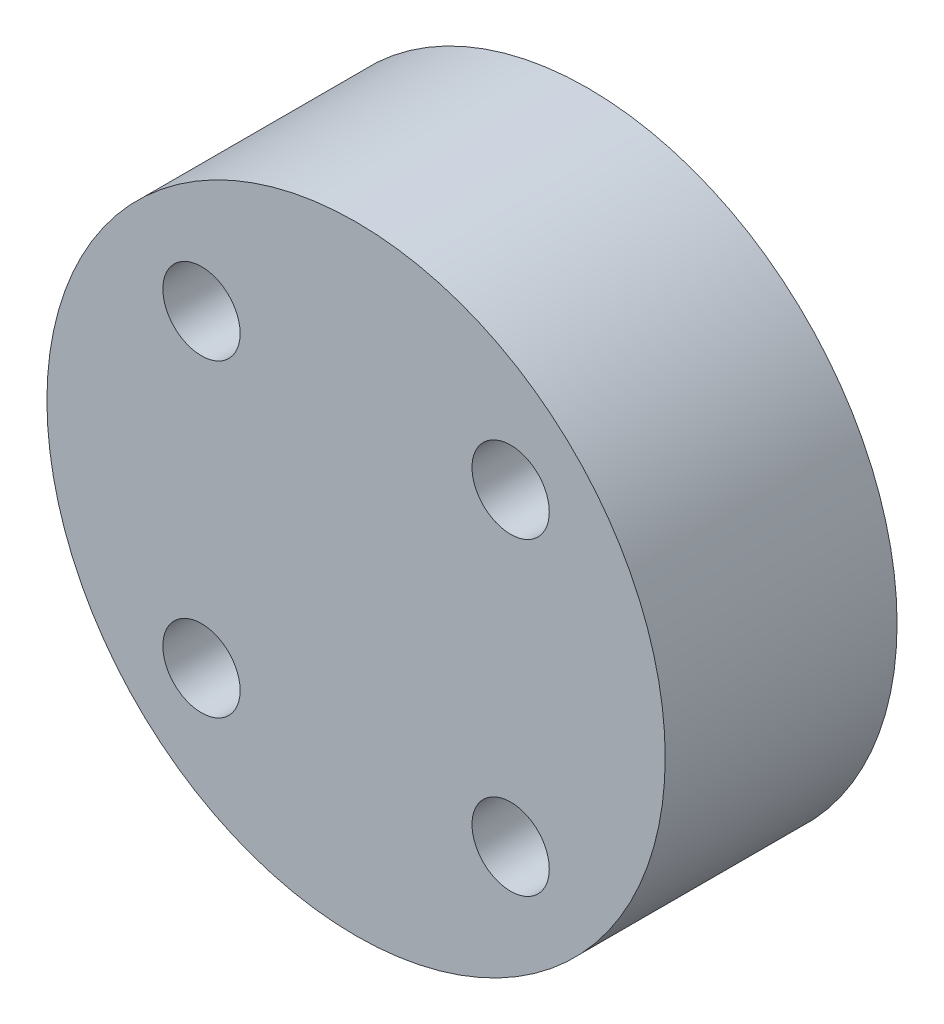
ISO-10303-21;
HEADER;
FILE_DESCRIPTION(('STEP AP214'),'2;1');
FILE_NAME('part.step','',(''),(''),'','','');
FILE_SCHEMA(('AUTOMOTIVE_DESIGN { 1 0 10303 214 1 1 1 1 }'));
ENDSEC;
DATA;
#1=APPLICATION_CONTEXT('core data for automotive mechanical design processes');
#2=APPLICATION_PROTOCOL_DEFINITION('international standard','automotive_design',2000,#1);
#3=PRODUCT_CONTEXT('',#1,'mechanical');
#4=PRODUCT('Part','Part','',(#3));
#5=PRODUCT_RELATED_PRODUCT_CATEGORY('part','',(#4));
#6=PRODUCT_DEFINITION_FORMATION('','',#4);
#7=PRODUCT_DEFINITION_CONTEXT('part definition',#1,'design');
#8=PRODUCT_DEFINITION('design','',#6,#7);
#9=PRODUCT_DEFINITION_SHAPE('','',#8);
#10=(LENGTH_UNIT() NAMED_UNIT(*) SI_UNIT(.MILLI.,.METRE.));
#11=(NAMED_UNIT(*) PLANE_ANGLE_UNIT() SI_UNIT($,.RADIAN.));
#12=(NAMED_UNIT(*) SI_UNIT($,.STERADIAN.) SOLID_ANGLE_UNIT());
#13=UNCERTAINTY_MEASURE_WITH_UNIT(LENGTH_MEASURE(1.E-05),#10,'distance_accuracy_value','');
#14=(GEOMETRIC_REPRESENTATION_CONTEXT(3) GLOBAL_UNCERTAINTY_ASSIGNED_CONTEXT((#13)) GLOBAL_UNIT_ASSIGNED_CONTEXT((#10,
#11,#12)) REPRESENTATION_CONTEXT('',''));
#15=CARTESIAN_POINT('',(0.,0.,0.));
#16=DIRECTION('',(0.,0.,1.));
#17=DIRECTION('',(1.,0.,0.));
#18=AXIS2_PLACEMENT_3D('',#15,#16,#17);
#19=CARTESIAN_POINT('',(0.,0.,15.));
#20=DIRECTION('',(0.,0.,-1.));
#21=DIRECTION('',(-1.,0.,0.));
#22=AXIS2_PLACEMENT_3D('',#19,#20,#21);
#23=CYLINDRICAL_SURFACE('',#22,20.);
#24=CARTESIAN_POINT('',(0.,0.,15.));
#25=DIRECTION('',(0.,0.,1.));
#26=DIRECTION('',(1.,0.,0.));
#27=AXIS2_PLACEMENT_3D('',#24,#25,#26);
#28=CIRCLE('',#27,20.);
#29=CARTESIAN_POINT('',(20.,0.,15.));
#30=VERTEX_POINT('',#29);
#31=EDGE_CURVE('E10',#30,#30,#28,.T.);
#32=ORIENTED_EDGE('',*,*,#31,.F.);
#33=EDGE_LOOP('',(#32));
#34=FACE_BOUND('',#33,.T.);
#35=CARTESIAN_POINT('',(0.,0.,0.));
#36=DIRECTION('',(0.,0.,1.));
#37=DIRECTION('',(1.,0.,0.));
#38=AXIS2_PLACEMENT_3D('',#35,#36,#37);
#39=CIRCLE('',#38,20.);
#40=CARTESIAN_POINT('',(20.,0.,0.));
#41=VERTEX_POINT('',#40);
#42=EDGE_CURVE('E36',#41,#41,#39,.T.);
#43=ORIENTED_EDGE('',*,*,#42,.T.);
#44=EDGE_LOOP('',(#43));
#45=FACE_BOUND('',#44,.T.);
#46=ADVANCED_FACE('F33',(#34,#45),#23,.T.);
#47=CARTESIAN_POINT('',(0.,0.,15.));
#48=DIRECTION('',(0.,0.,1.));
#49=DIRECTION('',(1.,0.,0.));
#50=AXIS2_PLACEMENT_3D('',#47,#48,#49);
#51=PLANE('',#50);
#52=CARTESIAN_POINT('',(-9.99999999999972,-10.,15.));
#53=DIRECTION('',(0.,0.,1.));
#54=DIRECTION('',(1.,0.,0.));
#55=AXIS2_PLACEMENT_3D('',#52,#53,#54);
#56=CIRCLE('',#55,2.50000000000022);
#57=CARTESIAN_POINT('',(-7.4999999999995,-10.,15.));
#58=VERTEX_POINT('',#57);
#59=EDGE_CURVE('E51',#58,#58,#56,.T.);
#60=ORIENTED_EDGE('',*,*,#59,.F.);
#61=EDGE_LOOP('',(#60));
#62=FACE_BOUND('',#61,.T.);
#63=CARTESIAN_POINT('',(10.0000000000003,-9.99999999999972,15.));
#64=DIRECTION('',(0.,0.,1.));
#65=DIRECTION('',(1.,0.,0.));
#66=AXIS2_PLACEMENT_3D('',#63,#64,#65);
#67=CIRCLE('',#66,2.50000000000044);
#68=CARTESIAN_POINT('',(12.5000000000007,-9.99999999999972,15.));
#69=VERTEX_POINT('',#68);
#70=EDGE_CURVE('E57',#69,#69,#67,.T.);
#71=ORIENTED_EDGE('',*,*,#70,.F.);
#72=EDGE_LOOP('',(#71));
#73=FACE_BOUND('',#72,.T.);
#74=CARTESIAN_POINT('',(10.,10.0000000000003,15.));
#75=DIRECTION('',(0.,0.,1.));
#76=DIRECTION('',(1.,0.,0.));
#77=AXIS2_PLACEMENT_3D('',#74,#75,#76);
#78=CIRCLE('',#77,2.50000000000031);
#79=CARTESIAN_POINT('',(12.5000000000003,10.0000000000003,15.));
#80=VERTEX_POINT('',#79);
#81=EDGE_CURVE('E63',#80,#80,#78,.T.);
#82=ORIENTED_EDGE('',*,*,#81,.F.);
#83=EDGE_LOOP('',(#82));
#84=FACE_BOUND('',#83,.T.);
#85=CARTESIAN_POINT('',(-10.,10.,15.));
#86=DIRECTION('',(0.,0.,1.));
#87=DIRECTION('',(1.,0.,0.));
#88=AXIS2_PLACEMENT_3D('',#85,#86,#87);
#89=CIRCLE('',#88,2.5);
#90=CARTESIAN_POINT('',(-7.5,10.,15.));
#91=VERTEX_POINT('',#90);
#92=EDGE_CURVE('E45',#91,#91,#89,.T.);
#93=ORIENTED_EDGE('',*,*,#92,.F.);
#94=EDGE_LOOP('',(#93));
#95=FACE_BOUND('',#94,.T.);
#96=ORIENTED_EDGE('',*,*,#31,.T.);
#97=EDGE_LOOP('',(#96));
#98=FACE_BOUND('',#97,.T.);
#99=ADVANCED_FACE('F80',(#62,#73,#84,#95,#98),#51,.T.);
#100=CARTESIAN_POINT('',(0.,0.,0.));
#101=DIRECTION('',(0.,0.,1.));
#102=DIRECTION('',(1.,0.,0.));
#103=AXIS2_PLACEMENT_3D('',#100,#101,#102);
#104=PLANE('',#103);
#105=CARTESIAN_POINT('',(-9.99999999999972,-10.,0.));
#106=DIRECTION('',(0.,0.,1.));
#107=DIRECTION('',(1.,0.,0.));
#108=AXIS2_PLACEMENT_3D('',#105,#106,#107);
#109=CIRCLE('',#108,2.50000000000022);
#110=CARTESIAN_POINT('',(-7.4999999999995,-10.,0.));
#111=VERTEX_POINT('',#110);
#112=EDGE_CURVE('E54',#111,#111,#109,.T.);
#113=ORIENTED_EDGE('',*,*,#112,.T.);
#114=EDGE_LOOP('',(#113));
#115=FACE_BOUND('',#114,.T.);
#116=CARTESIAN_POINT('',(10.0000000000003,-9.99999999999972,0.));
#117=DIRECTION('',(0.,0.,1.));
#118=DIRECTION('',(1.,0.,0.));
#119=AXIS2_PLACEMENT_3D('',#116,#117,#118);
#120=CIRCLE('',#119,2.50000000000044);
#121=CARTESIAN_POINT('',(12.5000000000007,-9.99999999999972,0.));
#122=VERTEX_POINT('',#121);
#123=EDGE_CURVE('E60',#122,#122,#120,.T.);
#124=ORIENTED_EDGE('',*,*,#123,.T.);
#125=EDGE_LOOP('',(#124));
#126=FACE_BOUND('',#125,.T.);
#127=CARTESIAN_POINT('',(10.,10.0000000000003,0.));
#128=DIRECTION('',(0.,0.,1.));
#129=DIRECTION('',(1.,0.,0.));
#130=AXIS2_PLACEMENT_3D('',#127,#128,#129);
#131=CIRCLE('',#130,2.50000000000031);
#132=CARTESIAN_POINT('',(12.5000000000003,10.0000000000003,0.));
#133=VERTEX_POINT('',#132);
#134=EDGE_CURVE('E48',#133,#133,#131,.T.);
#135=ORIENTED_EDGE('',*,*,#134,.T.);
#136=EDGE_LOOP('',(#135));
#137=FACE_BOUND('',#136,.T.);
#138=CARTESIAN_POINT('',(-10.,10.,0.));
#139=DIRECTION('',(0.,0.,1.));
#140=DIRECTION('',(1.,0.,0.));
#141=AXIS2_PLACEMENT_3D('',#138,#139,#140);
#142=CIRCLE('',#141,2.5);
#143=CARTESIAN_POINT('',(-7.5,10.,0.));
#144=VERTEX_POINT('',#143);
#145=EDGE_CURVE('E43',#144,#144,#142,.T.);
#146=ORIENTED_EDGE('',*,*,#145,.T.);
#147=EDGE_LOOP('',(#146));
#148=FACE_BOUND('',#147,.T.);
#149=ORIENTED_EDGE('',*,*,#42,.F.);
#150=EDGE_LOOP('',(#149));
#151=FACE_BOUND('',#150,.T.);
#152=ADVANCED_FACE('F69',(#115,#126,#137,#148,#151),#104,.F.);
#153=CARTESIAN_POINT('',(-10.,10.,0.));
#154=DIRECTION('',(0.,0.,1.));
#155=DIRECTION('',(1.,0.,0.));
#156=AXIS2_PLACEMENT_3D('',#153,#154,#155);
#157=CYLINDRICAL_SURFACE('',#156,2.5);
#158=ORIENTED_EDGE('',*,*,#145,.F.);
#159=EDGE_LOOP('',(#158));
#160=FACE_BOUND('',#159,.T.);
#161=ORIENTED_EDGE('',*,*,#92,.T.);
#162=EDGE_LOOP('',(#161));
#163=FACE_BOUND('',#162,.T.);
#164=ADVANCED_FACE('F76',(#160,#163),#157,.F.);
#165=CARTESIAN_POINT('',(10.,10.0000000000003,0.));
#166=DIRECTION('',(0.,0.,1.));
#167=DIRECTION('',(1.,0.,0.));
#168=AXIS2_PLACEMENT_3D('',#165,#166,#167);
#169=CYLINDRICAL_SURFACE('',#168,2.50000000000031);
#170=ORIENTED_EDGE('',*,*,#134,.F.);
#171=EDGE_LOOP('',(#170));
#172=FACE_BOUND('',#171,.T.);
#173=ORIENTED_EDGE('',*,*,#81,.T.);
#174=EDGE_LOOP('',(#173));
#175=FACE_BOUND('',#174,.T.);
#176=ADVANCED_FACE('F72',(#172,#175),#169,.F.);
#177=CARTESIAN_POINT('',(10.0000000000003,-9.99999999999972,0.));
#178=DIRECTION('',(0.,0.,1.));
#179=DIRECTION('',(1.,0.,0.));
#180=AXIS2_PLACEMENT_3D('',#177,#178,#179);
#181=CYLINDRICAL_SURFACE('',#180,2.50000000000044);
#182=ORIENTED_EDGE('',*,*,#123,.F.);
#183=EDGE_LOOP('',(#182));
#184=FACE_BOUND('',#183,.T.);
#185=ORIENTED_EDGE('',*,*,#70,.T.);
#186=EDGE_LOOP('',(#185));
#187=FACE_BOUND('',#186,.T.);
#188=ADVANCED_FACE('F75',(#184,#187),#181,.F.);
#189=CARTESIAN_POINT('',(-9.99999999999972,-10.,0.));
#190=DIRECTION('',(0.,0.,1.));
#191=DIRECTION('',(1.,0.,0.));
#192=AXIS2_PLACEMENT_3D('',#189,#190,#191);
#193=CYLINDRICAL_SURFACE('',#192,2.50000000000022);
#194=ORIENTED_EDGE('',*,*,#112,.F.);
#195=EDGE_LOOP('',(#194));
#196=FACE_BOUND('',#195,.T.);
#197=ORIENTED_EDGE('',*,*,#59,.T.);
#198=EDGE_LOOP('',(#197));
#199=FACE_BOUND('',#198,.T.);
#200=ADVANCED_FACE('F130',(#196,#199),#193,.F.);
#201=CLOSED_SHELL('',(#46,#99,#152,#164,#176,#188,#200));
#202=MANIFOLD_SOLID_BREP('B2',#201);
#203=ADVANCED_BREP_SHAPE_REPRESENTATION('',(#18,#202),#14);
#204=SHAPE_DEFINITION_REPRESENTATION(#9,#203);
ENDSEC;
END-ISO-10303-21;
